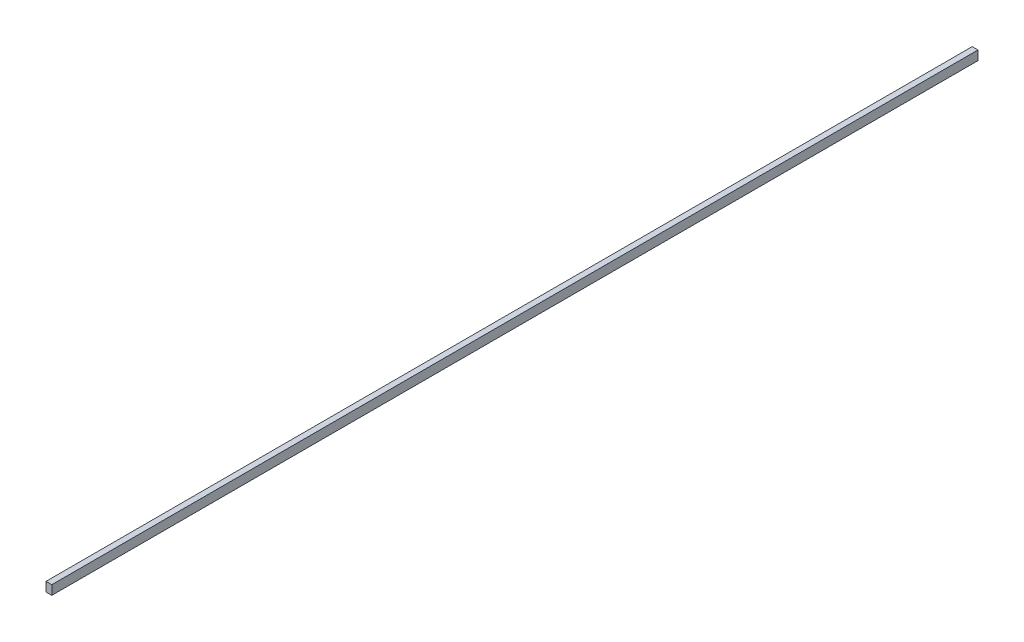
ISO-10303-21;
HEADER;
FILE_DESCRIPTION(('STEP AP214'),'2;1');
FILE_NAME('part.step','',(''),(''),'','','');
FILE_SCHEMA(('AUTOMOTIVE_DESIGN { 1 0 10303 214 1 1 1 1 }'));
ENDSEC;
DATA;
#1=APPLICATION_CONTEXT('core data for automotive mechanical design processes');
#2=APPLICATION_PROTOCOL_DEFINITION('international standard','automotive_design',2000,#1);
#3=PRODUCT_CONTEXT('',#1,'mechanical');
#4=PRODUCT('Part','Part','',(#3));
#5=PRODUCT_RELATED_PRODUCT_CATEGORY('part','',(#4));
#6=PRODUCT_DEFINITION_FORMATION('','',#4);
#7=PRODUCT_DEFINITION_CONTEXT('part definition',#1,'design');
#8=PRODUCT_DEFINITION('design','',#6,#7);
#9=PRODUCT_DEFINITION_SHAPE('','',#8);
#10=(LENGTH_UNIT() NAMED_UNIT(*) SI_UNIT(.MILLI.,.METRE.));
#11=(NAMED_UNIT(*) PLANE_ANGLE_UNIT() SI_UNIT($,.RADIAN.));
#12=(NAMED_UNIT(*) SI_UNIT($,.STERADIAN.) SOLID_ANGLE_UNIT());
#13=UNCERTAINTY_MEASURE_WITH_UNIT(LENGTH_MEASURE(1.E-05),#10,'distance_accuracy_value','');
#14=(GEOMETRIC_REPRESENTATION_CONTEXT(3) GLOBAL_UNCERTAINTY_ASSIGNED_CONTEXT((#13)) GLOBAL_UNIT_ASSIGNED_CONTEXT((#10,
#11,#12)) REPRESENTATION_CONTEXT('',''));
#15=CARTESIAN_POINT('',(0.,0.,0.));
#16=DIRECTION('',(0.,0.,1.));
#17=DIRECTION('',(1.,0.,0.));
#18=AXIS2_PLACEMENT_3D('',#15,#16,#17);
#19=CARTESIAN_POINT('',(-25.,40.,8000.));
#20=DIRECTION('',(1.,0.,0.));
#21=DIRECTION('',(0.,1.,0.));
#22=AXIS2_PLACEMENT_3D('',#19,#20,#21);
#23=PLANE('',#22);
#24=DIRECTION('',(0.,-1.,0.));
#25=VECTOR('',#24,1.);
#26=CARTESIAN_POINT('',(-25.,40.,0.));
#27=LINE('',#26,#25);
#28=CARTESIAN_POINT('',(-25.,40.,0.));
#29=VERTEX_POINT('',#28);
#30=CARTESIAN_POINT('',(-25.,-40.,0.));
#31=VERTEX_POINT('',#30);
#32=EDGE_CURVE('E141',#29,#31,#27,.T.);
#33=ORIENTED_EDGE('',*,*,#32,.T.);
#34=DIRECTION('',(0.,0.,-1.));
#35=VECTOR('',#34,1.);
#36=CARTESIAN_POINT('',(-25.,-40.,8000.));
#37=LINE('',#36,#35);
#38=CARTESIAN_POINT('',(-25.,-40.,8000.));
#39=VERTEX_POINT('',#38);
#40=EDGE_CURVE('E11',#39,#31,#37,.T.);
#41=ORIENTED_EDGE('',*,*,#40,.F.);
#42=DIRECTION('',(0.,-1.,0.));
#43=VECTOR('',#42,1.);
#44=CARTESIAN_POINT('',(-25.,40.,8000.));
#45=LINE('',#44,#43);
#46=CARTESIAN_POINT('',(-25.,40.,8000.));
#47=VERTEX_POINT('',#46);
#48=EDGE_CURVE('E145',#47,#39,#45,.T.);
#49=ORIENTED_EDGE('',*,*,#48,.F.);
#50=DIRECTION('',(0.,0.,-1.));
#51=VECTOR('',#50,1.);
#52=CARTESIAN_POINT('',(-25.,40.,8000.));
#53=LINE('',#52,#51);
#54=EDGE_CURVE('E57',#47,#29,#53,.T.);
#55=ORIENTED_EDGE('',*,*,#54,.T.);
#56=EDGE_LOOP('',(#33,#41,#49,#55));
#57=FACE_BOUND('',#56,.T.);
#58=ADVANCED_FACE('F34',(#57),#23,.F.);
#59=CARTESIAN_POINT('',(-25.,-40.,8000.));
#60=DIRECTION('',(0.,1.,0.));
#61=DIRECTION('',(0.,0.,1.));
#62=AXIS2_PLACEMENT_3D('',#59,#60,#61);
#63=PLANE('',#62);
#64=DIRECTION('',(1.,0.,0.));
#65=VECTOR('',#64,1.);
#66=CARTESIAN_POINT('',(-25.,-40.,0.));
#67=LINE('',#66,#65);
#68=CARTESIAN_POINT('',(25.,-40.,0.));
#69=VERTEX_POINT('',#68);
#70=EDGE_CURVE('E155',#31,#69,#67,.T.);
#71=ORIENTED_EDGE('',*,*,#70,.T.);
#72=DIRECTION('',(0.,0.,-1.));
#73=VECTOR('',#72,1.);
#74=CARTESIAN_POINT('',(25.,-40.,8000.));
#75=LINE('',#74,#73);
#76=CARTESIAN_POINT('',(25.,-40.,8000.));
#77=VERTEX_POINT('',#76);
#78=EDGE_CURVE('E41',#77,#69,#75,.T.);
#79=ORIENTED_EDGE('',*,*,#78,.F.);
#80=DIRECTION('',(1.,0.,0.));
#81=VECTOR('',#80,1.);
#82=CARTESIAN_POINT('',(-25.,-40.,8000.));
#83=LINE('',#82,#81);
#84=EDGE_CURVE('E83',#39,#77,#83,.T.);
#85=ORIENTED_EDGE('',*,*,#84,.F.);
#86=ORIENTED_EDGE('',*,*,#40,.T.);
#87=EDGE_LOOP('',(#71,#79,#85,#86));
#88=FACE_BOUND('',#87,.T.);
#89=ADVANCED_FACE('F169',(#88),#63,.F.);
#90=CARTESIAN_POINT('',(25.,40.,8000.));
#91=DIRECTION('',(1.,0.,0.));
#92=DIRECTION('',(0.,0.,-1.));
#93=AXIS2_PLACEMENT_3D('',#90,#91,#92);
#94=PLANE('',#93);
#95=DIRECTION('',(0.,-1.,0.));
#96=VECTOR('',#95,1.);
#97=CARTESIAN_POINT('',(25.,40.,0.));
#98=LINE('',#97,#96);
#99=CARTESIAN_POINT('',(25.,40.,0.));
#100=VERTEX_POINT('',#99);
#101=EDGE_CURVE('E158',#100,#69,#98,.T.);
#102=ORIENTED_EDGE('',*,*,#101,.F.);
#103=DIRECTION('',(0.,0.,-1.));
#104=VECTOR('',#103,1.);
#105=CARTESIAN_POINT('',(25.,40.,8000.));
#106=LINE('',#105,#104);
#107=CARTESIAN_POINT('',(25.,40.,8000.));
#108=VERTEX_POINT('',#107);
#109=EDGE_CURVE('E164',#108,#100,#106,.T.);
#110=ORIENTED_EDGE('',*,*,#109,.F.);
#111=DIRECTION('',(0.,-1.,0.));
#112=VECTOR('',#111,1.);
#113=CARTESIAN_POINT('',(25.,40.,8000.));
#114=LINE('',#113,#112);
#115=EDGE_CURVE('E149',#108,#77,#114,.T.);
#116=ORIENTED_EDGE('',*,*,#115,.T.);
#117=ORIENTED_EDGE('',*,*,#78,.T.);
#118=EDGE_LOOP('',(#102,#110,#116,#117));
#119=FACE_BOUND('',#118,.T.);
#120=ADVANCED_FACE('F167',(#119),#94,.T.);
#121=CARTESIAN_POINT('',(-25.,40.,8000.));
#122=DIRECTION('',(0.,1.,0.));
#123=DIRECTION('',(0.,0.,1.));
#124=AXIS2_PLACEMENT_3D('',#121,#122,#123);
#125=PLANE('',#124);
#126=DIRECTION('',(1.,0.,0.));
#127=VECTOR('',#126,1.);
#128=CARTESIAN_POINT('',(-25.,40.,0.));
#129=LINE('',#128,#127);
#130=EDGE_CURVE('E147',#29,#100,#129,.T.);
#131=ORIENTED_EDGE('',*,*,#130,.F.);
#132=ORIENTED_EDGE('',*,*,#54,.F.);
#133=DIRECTION('',(1.,0.,0.));
#134=VECTOR('',#133,1.);
#135=CARTESIAN_POINT('',(-25.,40.,8000.));
#136=LINE('',#135,#134);
#137=EDGE_CURVE('E152',#47,#108,#136,.T.);
#138=ORIENTED_EDGE('',*,*,#137,.T.);
#139=ORIENTED_EDGE('',*,*,#109,.T.);
#140=EDGE_LOOP('',(#131,#132,#138,#139));
#141=FACE_BOUND('',#140,.T.);
#142=ADVANCED_FACE('F173',(#141),#125,.T.);
#143=CARTESIAN_POINT('',(0.,0.,8000.));
#144=DIRECTION('',(0.,0.,1.));
#145=DIRECTION('',(1.,0.,0.));
#146=AXIS2_PLACEMENT_3D('',#143,#144,#145);
#147=PLANE('',#146);
#148=ORIENTED_EDGE('',*,*,#48,.T.);
#149=ORIENTED_EDGE('',*,*,#84,.T.);
#150=ORIENTED_EDGE('',*,*,#115,.F.);
#151=ORIENTED_EDGE('',*,*,#137,.F.);
#152=EDGE_LOOP('',(#148,#149,#150,#151));
#153=FACE_BOUND('',#152,.T.);
#154=ADVANCED_FACE('F176',(#153),#147,.T.);
#155=CARTESIAN_POINT('',(0.,0.,0.));
#156=DIRECTION('',(0.,0.,1.));
#157=DIRECTION('',(1.,0.,0.));
#158=AXIS2_PLACEMENT_3D('',#155,#156,#157);
#159=PLANE('',#158);
#160=DIRECTION('',(1.,0.,0.));
#161=VECTOR('',#160,1.);
#162=CARTESIAN_POINT('',(21.,36.,0.));
#163=LINE('',#162,#161);
#164=CARTESIAN_POINT('',(-21.,36.,0.));
#165=VERTEX_POINT('',#164);
#166=CARTESIAN_POINT('',(21.,36.,0.));
#167=VERTEX_POINT('',#166);
#168=EDGE_CURVE('E135',#165,#167,#163,.T.);
#169=ORIENTED_EDGE('',*,*,#168,.F.);
#170=DIRECTION('',(0.,1.,0.));
#171=VECTOR('',#170,1.);
#172=CARTESIAN_POINT('',(-21.,36.,0.));
#173=LINE('',#172,#171);
#174=CARTESIAN_POINT('',(-21.,-36.,0.));
#175=VERTEX_POINT('',#174);
#176=EDGE_CURVE('E48',#175,#165,#173,.T.);
#177=ORIENTED_EDGE('',*,*,#176,.F.);
#178=DIRECTION('',(-1.,0.,0.));
#179=VECTOR('',#178,1.);
#180=CARTESIAN_POINT('',(21.,-36.,0.));
#181=LINE('',#180,#179);
#182=CARTESIAN_POINT('',(21.,-36.,0.));
#183=VERTEX_POINT('',#182);
#184=EDGE_CURVE('E126',#183,#175,#181,.T.);
#185=ORIENTED_EDGE('',*,*,#184,.F.);
#186=DIRECTION('',(0.,-1.,0.));
#187=VECTOR('',#186,1.);
#188=CARTESIAN_POINT('',(21.,36.,0.));
#189=LINE('',#188,#187);
#190=EDGE_CURVE('E129',#167,#183,#189,.T.);
#191=ORIENTED_EDGE('',*,*,#190,.F.);
#192=EDGE_LOOP('',(#169,#177,#185,#191));
#193=FACE_BOUND('',#192,.T.);
#194=ORIENTED_EDGE('',*,*,#32,.F.);
#195=ORIENTED_EDGE('',*,*,#130,.T.);
#196=ORIENTED_EDGE('',*,*,#101,.T.);
#197=ORIENTED_EDGE('',*,*,#70,.F.);
#198=EDGE_LOOP('',(#194,#195,#196,#197));
#199=FACE_BOUND('',#198,.T.);
#200=ADVANCED_FACE('F172',(#193,#199),#159,.F.);
#201=CARTESIAN_POINT('',(-21.,36.,6000.));
#202=DIRECTION('',(-1.,0.,0.));
#203=DIRECTION('',(0.,-1.,0.));
#204=AXIS2_PLACEMENT_3D('',#201,#202,#203);
#205=PLANE('',#204);
#206=ORIENTED_EDGE('',*,*,#176,.T.);
#207=DIRECTION('',(0.,0.,-1.));
#208=VECTOR('',#207,1.);
#209=CARTESIAN_POINT('',(-21.,36.,6000.));
#210=LINE('',#209,#208);
#211=CARTESIAN_POINT('',(-21.,36.,6000.));
#212=VERTEX_POINT('',#211);
#213=EDGE_CURVE('E104',#212,#165,#210,.T.);
#214=ORIENTED_EDGE('',*,*,#213,.F.);
#215=DIRECTION('',(0.,1.,0.));
#216=VECTOR('',#215,1.);
#217=CARTESIAN_POINT('',(-21.,36.,6000.));
#218=LINE('',#217,#216);
#219=CARTESIAN_POINT('',(-21.,-36.,6000.));
#220=VERTEX_POINT('',#219);
#221=EDGE_CURVE('E108',#220,#212,#218,.T.);
#222=ORIENTED_EDGE('',*,*,#221,.F.);
#223=DIRECTION('',(0.,0.,-1.));
#224=VECTOR('',#223,1.);
#225=CARTESIAN_POINT('',(-21.,-36.,6000.));
#226=LINE('',#225,#224);
#227=EDGE_CURVE('E139',#220,#175,#226,.T.);
#228=ORIENTED_EDGE('',*,*,#227,.T.);
#229=EDGE_LOOP('',(#206,#214,#222,#228));
#230=FACE_BOUND('',#229,.T.);
#231=ADVANCED_FACE('F106',(#230),#205,.F.);
#232=CARTESIAN_POINT('',(21.,-36.,6000.));
#233=DIRECTION('',(0.,-1.,0.));
#234=DIRECTION('',(0.,0.,-1.));
#235=AXIS2_PLACEMENT_3D('',#232,#233,#234);
#236=PLANE('',#235);
#237=ORIENTED_EDGE('',*,*,#184,.T.);
#238=ORIENTED_EDGE('',*,*,#227,.F.);
#239=DIRECTION('',(-1.,0.,0.));
#240=VECTOR('',#239,1.);
#241=CARTESIAN_POINT('',(21.,-36.,6000.));
#242=LINE('',#241,#240);
#243=CARTESIAN_POINT('',(21.,-36.,6000.));
#244=VERTEX_POINT('',#243);
#245=EDGE_CURVE('E114',#244,#220,#242,.T.);
#246=ORIENTED_EDGE('',*,*,#245,.F.);
#247=DIRECTION('',(0.,0.,-1.));
#248=VECTOR('',#247,1.);
#249=CARTESIAN_POINT('',(21.,-36.,6000.));
#250=LINE('',#249,#248);
#251=EDGE_CURVE('E142',#244,#183,#250,.T.);
#252=ORIENTED_EDGE('',*,*,#251,.T.);
#253=EDGE_LOOP('',(#237,#238,#246,#252));
#254=FACE_BOUND('',#253,.T.);
#255=ADVANCED_FACE('F195',(#254),#236,.F.);
#256=CARTESIAN_POINT('',(21.,36.,6000.));
#257=DIRECTION('',(1.,0.,0.));
#258=DIRECTION('',(0.,1.,0.));
#259=AXIS2_PLACEMENT_3D('',#256,#257,#258);
#260=PLANE('',#259);
#261=ORIENTED_EDGE('',*,*,#190,.T.);
#262=ORIENTED_EDGE('',*,*,#251,.F.);
#263=DIRECTION('',(0.,-1.,0.));
#264=VECTOR('',#263,1.);
#265=CARTESIAN_POINT('',(21.,36.,6000.));
#266=LINE('',#265,#264);
#267=CARTESIAN_POINT('',(21.,36.,6000.));
#268=VERTEX_POINT('',#267);
#269=EDGE_CURVE('E122',#268,#244,#266,.T.);
#270=ORIENTED_EDGE('',*,*,#269,.F.);
#271=DIRECTION('',(0.,0.,-1.));
#272=VECTOR('',#271,1.);
#273=CARTESIAN_POINT('',(21.,36.,6000.));
#274=LINE('',#273,#272);
#275=EDGE_CURVE('E113',#268,#167,#274,.T.);
#276=ORIENTED_EDGE('',*,*,#275,.T.);
#277=EDGE_LOOP('',(#261,#262,#270,#276));
#278=FACE_BOUND('',#277,.T.);
#279=ADVANCED_FACE('F198',(#278),#260,.F.);
#280=CARTESIAN_POINT('',(21.,36.,6000.));
#281=DIRECTION('',(0.,1.,0.));
#282=DIRECTION('',(0.,0.,1.));
#283=AXIS2_PLACEMENT_3D('',#280,#281,#282);
#284=PLANE('',#283);
#285=ORIENTED_EDGE('',*,*,#168,.T.);
#286=ORIENTED_EDGE('',*,*,#275,.F.);
#287=DIRECTION('',(1.,0.,0.));
#288=VECTOR('',#287,1.);
#289=CARTESIAN_POINT('',(21.,36.,6000.));
#290=LINE('',#289,#288);
#291=EDGE_CURVE('E117',#212,#268,#290,.T.);
#292=ORIENTED_EDGE('',*,*,#291,.F.);
#293=ORIENTED_EDGE('',*,*,#213,.T.);
#294=EDGE_LOOP('',(#285,#286,#292,#293));
#295=FACE_BOUND('',#294,.T.);
#296=ADVANCED_FACE('F118',(#295),#284,.F.);
#297=CARTESIAN_POINT('',(0.,0.,6000.));
#298=DIRECTION('',(0.,0.,-1.));
#299=DIRECTION('',(-1.,0.,0.));
#300=AXIS2_PLACEMENT_3D('',#297,#298,#299);
#301=PLANE('',#300);
#302=ORIENTED_EDGE('',*,*,#221,.T.);
#303=ORIENTED_EDGE('',*,*,#291,.T.);
#304=ORIENTED_EDGE('',*,*,#269,.T.);
#305=ORIENTED_EDGE('',*,*,#245,.T.);
#306=EDGE_LOOP('',(#302,#303,#304,#305));
#307=FACE_BOUND('',#306,.T.);
#308=ADVANCED_FACE('F124',(#307),#301,.T.);
#309=CLOSED_SHELL('',(#58,#89,#120,#142,#154,#200,#231,#255,#279,#296,#308));
#310=MANIFOLD_SOLID_BREP('B2',#309);
#311=ADVANCED_BREP_SHAPE_REPRESENTATION('',(#18,#310),#14);
#312=SHAPE_DEFINITION_REPRESENTATION(#9,#311);
ENDSEC;
END-ISO-10303-21;
